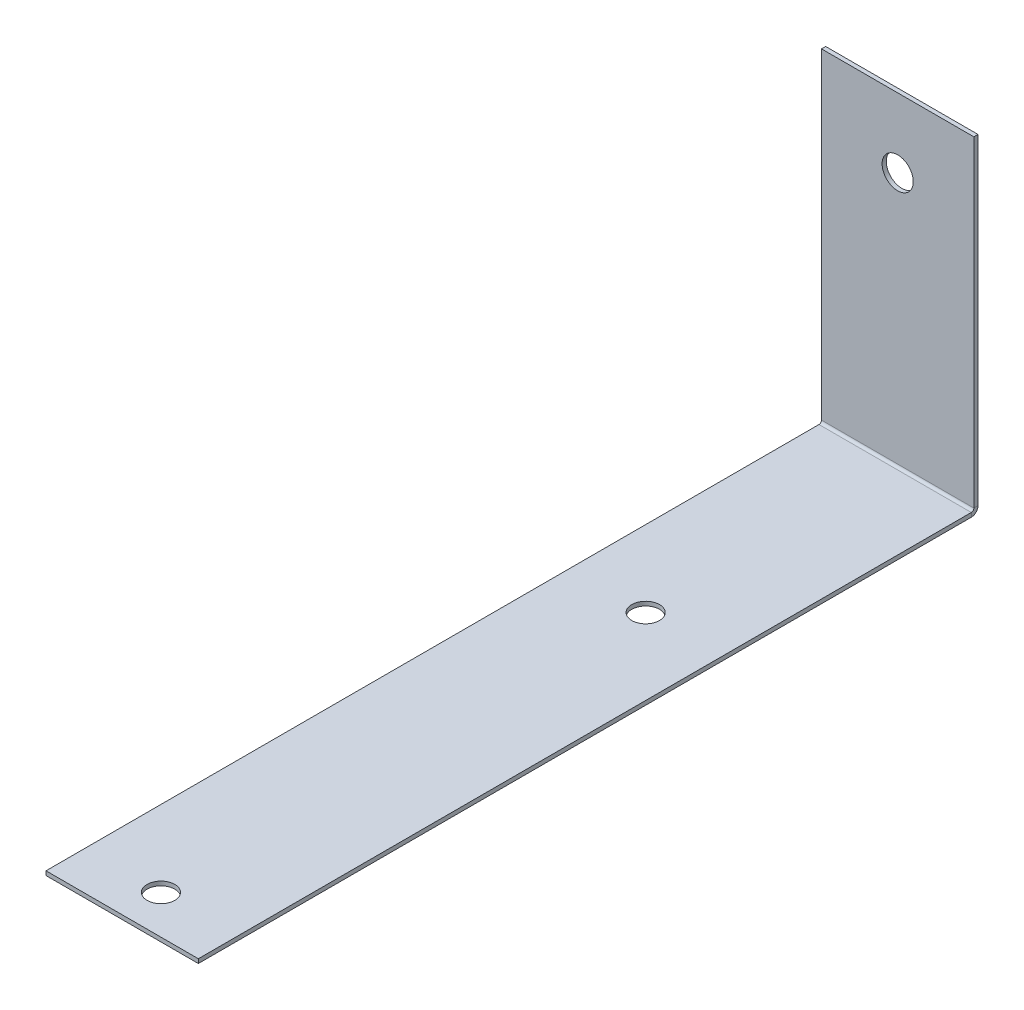
ISO-10303-21;
HEADER;
FILE_DESCRIPTION(('STEP AP214'),'2;1');
FILE_NAME('part.step','',(''),(''),'','','');
FILE_SCHEMA(('AUTOMOTIVE_DESIGN { 1 0 10303 214 1 1 1 1 }'));
ENDSEC;
DATA;
#1=APPLICATION_CONTEXT('core data for automotive mechanical design processes');
#2=APPLICATION_PROTOCOL_DEFINITION('international standard','automotive_design',2000,#1);
#3=PRODUCT_CONTEXT('',#1,'mechanical');
#4=PRODUCT('Part','Part','',(#3));
#5=PRODUCT_RELATED_PRODUCT_CATEGORY('part','',(#4));
#6=PRODUCT_DEFINITION_FORMATION('','',#4);
#7=PRODUCT_DEFINITION_CONTEXT('part definition',#1,'design');
#8=PRODUCT_DEFINITION('design','',#6,#7);
#9=PRODUCT_DEFINITION_SHAPE('','',#8);
#10=(LENGTH_UNIT() NAMED_UNIT(*) SI_UNIT(.MILLI.,.METRE.));
#11=(NAMED_UNIT(*) PLANE_ANGLE_UNIT() SI_UNIT($,.RADIAN.));
#12=(NAMED_UNIT(*) SI_UNIT($,.STERADIAN.) SOLID_ANGLE_UNIT());
#13=UNCERTAINTY_MEASURE_WITH_UNIT(LENGTH_MEASURE(1.E-05),#10,'distance_accuracy_value','');
#14=(GEOMETRIC_REPRESENTATION_CONTEXT(3) GLOBAL_UNCERTAINTY_ASSIGNED_CONTEXT((#13)) GLOBAL_UNIT_ASSIGNED_CONTEXT((#10,
#11,#12)) REPRESENTATION_CONTEXT('',''));
#15=CARTESIAN_POINT('',(0.,0.,0.));
#16=DIRECTION('',(0.,0.,1.));
#17=DIRECTION('',(1.,0.,0.));
#18=AXIS2_PLACEMENT_3D('',#15,#16,#17);
#19=CARTESIAN_POINT('',(0.,-66.4,-64.0000000000003));
#20=DIRECTION('',(0.,0.,-1.));
#21=DIRECTION('',(0.,1.,0.));
#22=AXIS2_PLACEMENT_3D('',#19,#20,#21);
#23=PLANE('',#22);
#24=CARTESIAN_POINT('',(0.,73.5999999999999,-63.9999999999998));
#25=DIRECTION('',(0.,0.,-1.));
#26=DIRECTION('',(0.,1.,0.));
#27=AXIS2_PLACEMENT_3D('',#24,#25,#26);
#28=CIRCLE('',#27,4.5);
#29=CARTESIAN_POINT('',(0.,78.0999999999999,-63.9999999999998));
#30=VERTEX_POINT('',#29);
#31=EDGE_CURVE('E210',#30,#30,#28,.T.);
#32=ORIENTED_EDGE('',*,*,#31,.T.);
#33=EDGE_LOOP('',(#32));
#34=FACE_BOUND('',#33,.T.);
#35=DIRECTION('',(0.,-1.,0.));
#36=VECTOR('',#35,1.);
#37=CARTESIAN_POINT('',(-22.,93.6,-63.9999999999997));
#38=LINE('',#37,#36);
#39=CARTESIAN_POINT('',(-22.,93.6,-63.9999999999997));
#40=VERTEX_POINT('',#39);
#41=CARTESIAN_POINT('',(-22.,0.736600000000004,-64.));
#42=VERTEX_POINT('',#41);
#43=EDGE_CURVE('E66',#40,#42,#38,.T.);
#44=ORIENTED_EDGE('',*,*,#43,.T.);
#45=DIRECTION('',(1.,0.,0.));
#46=VECTOR('',#45,1.);
#47=CARTESIAN_POINT('',(0.,0.736600000000004,-64.));
#48=LINE('',#47,#46);
#49=CARTESIAN_POINT('',(22.,0.736600000000004,-64.));
#50=VERTEX_POINT('',#49);
#51=EDGE_CURVE('E58',#42,#50,#48,.T.);
#52=ORIENTED_EDGE('',*,*,#51,.T.);
#53=DIRECTION('',(0.,1.,0.));
#54=VECTOR('',#53,1.);
#55=CARTESIAN_POINT('',(22.,93.6,-63.9999999999997));
#56=LINE('',#55,#54);
#57=CARTESIAN_POINT('',(22.,93.6,-63.9999999999997));
#58=VERTEX_POINT('',#57);
#59=EDGE_CURVE('E74',#50,#58,#56,.T.);
#60=ORIENTED_EDGE('',*,*,#59,.T.);
#61=DIRECTION('',(-1.,0.,0.));
#62=VECTOR('',#61,1.);
#63=CARTESIAN_POINT('',(22.,93.6,-63.9999999999997));
#64=LINE('',#63,#62);
#65=EDGE_CURVE('E177',#58,#40,#64,.T.);
#66=ORIENTED_EDGE('',*,*,#65,.T.);
#67=EDGE_LOOP('',(#44,#52,#60,#66));
#68=FACE_BOUND('',#67,.T.);
#69=ADVANCED_FACE('F49',(#34,#68),#23,.F.);
#70=CARTESIAN_POINT('',(-22.,93.6,-65.1999999999997));
#71=DIRECTION('',(-1.,0.,0.));
#72=DIRECTION('',(0.,-1.,0.));
#73=AXIS2_PLACEMENT_3D('',#70,#71,#72);
#74=PLANE('',#73);
#75=DIRECTION('',(0.,0.,-1.));
#76=VECTOR('',#75,1.);
#77=CARTESIAN_POINT('',(-22.,0.736600000000004,-65.2));
#78=LINE('',#77,#76);
#79=CARTESIAN_POINT('',(-22.,0.736600000000004,-65.2));
#80=VERTEX_POINT('',#79);
#81=EDGE_CURVE('E12',#42,#80,#78,.T.);
#82=ORIENTED_EDGE('',*,*,#81,.F.);
#83=ORIENTED_EDGE('',*,*,#43,.F.);
#84=DIRECTION('',(0.,0.,1.));
#85=VECTOR('',#84,1.);
#86=CARTESIAN_POINT('',(-22.,93.6,-65.1999999999997));
#87=LINE('',#86,#85);
#88=CARTESIAN_POINT('',(-22.,93.6,-65.1999999999997));
#89=VERTEX_POINT('',#88);
#90=EDGE_CURVE('E180',#89,#40,#87,.T.);
#91=ORIENTED_EDGE('',*,*,#90,.F.);
#92=DIRECTION('',(0.,-1.,0.));
#93=VECTOR('',#92,1.);
#94=CARTESIAN_POINT('',(-22.,93.6,-65.1999999999997));
#95=LINE('',#94,#93);
#96=EDGE_CURVE('E179',#89,#80,#95,.T.);
#97=ORIENTED_EDGE('',*,*,#96,.T.);
#98=EDGE_LOOP('',(#82,#83,#91,#97));
#99=FACE_BOUND('',#98,.T.);
#100=ADVANCED_FACE('F51',(#99),#74,.T.);
#101=CARTESIAN_POINT('',(22.,93.6,-65.1999999999997));
#102=DIRECTION('',(0.,1.,0.));
#103=DIRECTION('',(-1.,0.,0.));
#104=AXIS2_PLACEMENT_3D('',#101,#102,#103);
#105=PLANE('',#104);
#106=ORIENTED_EDGE('',*,*,#65,.F.);
#107=DIRECTION('',(0.,0.,1.));
#108=VECTOR('',#107,1.);
#109=CARTESIAN_POINT('',(22.,93.6,-65.1999999999997));
#110=LINE('',#109,#108);
#111=CARTESIAN_POINT('',(22.,93.6,-65.1999999999997));
#112=VERTEX_POINT('',#111);
#113=EDGE_CURVE('E175',#112,#58,#110,.T.);
#114=ORIENTED_EDGE('',*,*,#113,.F.);
#115=DIRECTION('',(-1.,0.,0.));
#116=VECTOR('',#115,1.);
#117=CARTESIAN_POINT('',(22.,93.6,-65.1999999999997));
#118=LINE('',#117,#116);
#119=EDGE_CURVE('E172',#112,#89,#118,.T.);
#120=ORIENTED_EDGE('',*,*,#119,.T.);
#121=ORIENTED_EDGE('',*,*,#90,.T.);
#122=EDGE_LOOP('',(#106,#114,#120,#121));
#123=FACE_BOUND('',#122,.T.);
#124=ADVANCED_FACE('F238',(#123),#105,.T.);
#125=CARTESIAN_POINT('',(22.,93.6,-65.1999999999997));
#126=DIRECTION('',(1.,0.,0.));
#127=DIRECTION('',(0.,1.,0.));
#128=AXIS2_PLACEMENT_3D('',#125,#126,#127);
#129=PLANE('',#128);
#130=DIRECTION('',(0.,0.,1.));
#131=VECTOR('',#130,1.);
#132=CARTESIAN_POINT('',(22.,0.736600000000004,-65.2));
#133=LINE('',#132,#131);
#134=CARTESIAN_POINT('',(22.,0.736600000000002,-65.2));
#135=VERTEX_POINT('',#134);
#136=EDGE_CURVE('E185',#135,#50,#133,.T.);
#137=ORIENTED_EDGE('',*,*,#136,.F.);
#138=DIRECTION('',(0.,1.,0.));
#139=VECTOR('',#138,1.);
#140=CARTESIAN_POINT('',(22.,93.6,-65.1999999999997));
#141=LINE('',#140,#139);
#142=EDGE_CURVE('E176',#135,#112,#141,.T.);
#143=ORIENTED_EDGE('',*,*,#142,.T.);
#144=ORIENTED_EDGE('',*,*,#113,.T.);
#145=ORIENTED_EDGE('',*,*,#59,.F.);
#146=EDGE_LOOP('',(#137,#143,#144,#145));
#147=FACE_BOUND('',#146,.T.);
#148=ADVANCED_FACE('F230',(#147),#129,.T.);
#149=CARTESIAN_POINT('',(0.,-66.4,-65.2000000000003));
#150=DIRECTION('',(0.,0.,-1.));
#151=DIRECTION('',(0.,1.,0.));
#152=AXIS2_PLACEMENT_3D('',#149,#150,#151);
#153=PLANE('',#152);
#154=CARTESIAN_POINT('',(0.,73.5999999999999,-65.1999999999998));
#155=DIRECTION('',(0.,0.,-1.));
#156=DIRECTION('',(0.,1.,0.));
#157=AXIS2_PLACEMENT_3D('',#154,#155,#156);
#158=CIRCLE('',#157,4.5);
#159=CARTESIAN_POINT('',(0.,78.0999999999999,-65.1999999999997));
#160=VERTEX_POINT('',#159);
#161=EDGE_CURVE('E199',#160,#160,#158,.T.);
#162=ORIENTED_EDGE('',*,*,#161,.F.);
#163=EDGE_LOOP('',(#162));
#164=FACE_BOUND('',#163,.T.);
#165=DIRECTION('',(1.,0.,0.));
#166=VECTOR('',#165,1.);
#167=CARTESIAN_POINT('',(0.,0.736600000000004,-65.2));
#168=LINE('',#167,#166);
#169=EDGE_CURVE('E182',#80,#135,#168,.T.);
#170=ORIENTED_EDGE('',*,*,#169,.F.);
#171=ORIENTED_EDGE('',*,*,#96,.F.);
#172=ORIENTED_EDGE('',*,*,#119,.F.);
#173=ORIENTED_EDGE('',*,*,#142,.F.);
#174=EDGE_LOOP('',(#170,#171,#172,#173));
#175=FACE_BOUND('',#174,.T.);
#176=ADVANCED_FACE('F234',(#164,#175),#153,.T.);
#177=CARTESIAN_POINT('',(22.,-1.2,160.));
#178=DIRECTION('',(0.,0.,1.));
#179=DIRECTION('',(1.,0.,0.));
#180=AXIS2_PLACEMENT_3D('',#177,#178,#179);
#181=PLANE('',#180);
#182=DIRECTION('',(1.,0.,0.));
#183=VECTOR('',#182,1.);
#184=CARTESIAN_POINT('',(22.,0.,160.));
#185=LINE('',#184,#183);
#186=CARTESIAN_POINT('',(-22.,0.,160.));
#187=VERTEX_POINT('',#186);
#188=CARTESIAN_POINT('',(22.,0.,160.));
#189=VERTEX_POINT('',#188);
#190=EDGE_CURVE('E157',#187,#189,#185,.T.);
#191=ORIENTED_EDGE('',*,*,#190,.F.);
#192=DIRECTION('',(0.,1.,0.));
#193=VECTOR('',#192,1.);
#194=CARTESIAN_POINT('',(-22.,-1.2,160.));
#195=LINE('',#194,#193);
#196=CARTESIAN_POINT('',(-22.,-1.2,160.));
#197=VERTEX_POINT('',#196);
#198=EDGE_CURVE('E148',#197,#187,#195,.T.);
#199=ORIENTED_EDGE('',*,*,#198,.F.);
#200=DIRECTION('',(1.,0.,0.));
#201=VECTOR('',#200,1.);
#202=CARTESIAN_POINT('',(22.,-1.2,160.));
#203=LINE('',#202,#201);
#204=CARTESIAN_POINT('',(22.,-1.2,160.));
#205=VERTEX_POINT('',#204);
#206=EDGE_CURVE('E144',#197,#205,#203,.T.);
#207=ORIENTED_EDGE('',*,*,#206,.T.);
#208=DIRECTION('',(0.,1.,0.));
#209=VECTOR('',#208,1.);
#210=CARTESIAN_POINT('',(22.,-1.2,160.));
#211=LINE('',#210,#209);
#212=EDGE_CURVE('E138',#205,#189,#211,.T.);
#213=ORIENTED_EDGE('',*,*,#212,.T.);
#214=EDGE_LOOP('',(#191,#199,#207,#213));
#215=FACE_BOUND('',#214,.T.);
#216=ADVANCED_FACE('F219',(#215),#181,.T.);
#217=CARTESIAN_POINT('',(0.,-1.2,0.));
#218=DIRECTION('',(0.,-1.,0.));
#219=DIRECTION('',(0.,0.,-1.));
#220=AXIS2_PLACEMENT_3D('',#217,#218,#219);
#221=PLANE('',#220);
#222=CARTESIAN_POINT('',(0.,-1.2,8.79999999999997));
#223=DIRECTION('',(0.,-1.,0.));
#224=DIRECTION('',(0.,0.,-1.));
#225=AXIS2_PLACEMENT_3D('',#222,#223,#224);
#226=CIRCLE('',#225,4.);
#227=CARTESIAN_POINT('',(0.,-1.2,4.79999999999997));
#228=VERTEX_POINT('',#227);
#229=EDGE_CURVE('E195',#228,#228,#226,.T.);
#230=ORIENTED_EDGE('',*,*,#229,.F.);
#231=EDGE_LOOP('',(#230));
#232=FACE_BOUND('',#231,.T.);
#233=CARTESIAN_POINT('',(0.,-1.2,148.8));
#234=DIRECTION('',(0.,-1.,0.));
#235=DIRECTION('',(0.,0.,-1.));
#236=AXIS2_PLACEMENT_3D('',#233,#234,#235);
#237=CIRCLE('',#236,4.);
#238=CARTESIAN_POINT('',(0.,-1.2,144.8));
#239=VERTEX_POINT('',#238);
#240=EDGE_CURVE('E201',#239,#239,#237,.T.);
#241=ORIENTED_EDGE('',*,*,#240,.F.);
#242=EDGE_LOOP('',(#241));
#243=FACE_BOUND('',#242,.T.);
#244=DIRECTION('',(0.,0.,1.));
#245=VECTOR('',#244,1.);
#246=CARTESIAN_POINT('',(-22.,-1.2,-160.));
#247=LINE('',#246,#245);
#248=CARTESIAN_POINT('',(-22.,-1.2,-63.2634));
#249=VERTEX_POINT('',#248);
#250=EDGE_CURVE('E141',#249,#197,#247,.T.);
#251=ORIENTED_EDGE('',*,*,#250,.F.);
#252=DIRECTION('',(1.,0.,0.));
#253=VECTOR('',#252,1.);
#254=CARTESIAN_POINT('',(0.,-1.2,-63.2634));
#255=LINE('',#254,#253);
#256=CARTESIAN_POINT('',(22.,-1.2,-63.2634));
#257=VERTEX_POINT('',#256);
#258=EDGE_CURVE('E130',#249,#257,#255,.T.);
#259=ORIENTED_EDGE('',*,*,#258,.T.);
#260=DIRECTION('',(0.,0.,-1.));
#261=VECTOR('',#260,1.);
#262=CARTESIAN_POINT('',(22.,-1.2,-160.));
#263=LINE('',#262,#261);
#264=EDGE_CURVE('E137',#205,#257,#263,.T.);
#265=ORIENTED_EDGE('',*,*,#264,.F.);
#266=ORIENTED_EDGE('',*,*,#206,.F.);
#267=EDGE_LOOP('',(#251,#259,#265,#266));
#268=FACE_BOUND('',#267,.T.);
#269=ADVANCED_FACE('F142',(#232,#243,#268),#221,.T.);
#270=CARTESIAN_POINT('',(22.,-1.2,-160.));
#271=DIRECTION('',(1.,0.,0.));
#272=DIRECTION('',(0.,0.,-1.));
#273=AXIS2_PLACEMENT_3D('',#270,#271,#272);
#274=PLANE('',#273);
#275=ORIENTED_EDGE('',*,*,#264,.T.);
#276=DIRECTION('',(0.,1.,0.));
#277=VECTOR('',#276,1.);
#278=CARTESIAN_POINT('',(22.,-1.19999999999999,-63.2634));
#279=LINE('',#278,#277);
#280=CARTESIAN_POINT('',(22.,0.,-63.2634));
#281=VERTEX_POINT('',#280);
#282=EDGE_CURVE('E164',#257,#281,#279,.T.);
#283=ORIENTED_EDGE('',*,*,#282,.T.);
#284=DIRECTION('',(0.,0.,-1.));
#285=VECTOR('',#284,1.);
#286=CARTESIAN_POINT('',(22.,0.,-160.));
#287=LINE('',#286,#285);
#288=EDGE_CURVE('E154',#189,#281,#287,.T.);
#289=ORIENTED_EDGE('',*,*,#288,.F.);
#290=ORIENTED_EDGE('',*,*,#212,.F.);
#291=EDGE_LOOP('',(#275,#283,#289,#290));
#292=FACE_BOUND('',#291,.T.);
#293=ADVANCED_FACE('F258',(#292),#274,.T.);
#294=CARTESIAN_POINT('',(0.,0.,0.));
#295=DIRECTION('',(0.,-1.,0.));
#296=DIRECTION('',(0.,0.,-1.));
#297=AXIS2_PLACEMENT_3D('',#294,#295,#296);
#298=PLANE('',#297);
#299=CARTESIAN_POINT('',(0.,0.,8.79999999999997));
#300=DIRECTION('',(0.,-1.,0.));
#301=DIRECTION('',(0.,0.,-1.));
#302=AXIS2_PLACEMENT_3D('',#299,#300,#301);
#303=CIRCLE('',#302,4.);
#304=CARTESIAN_POINT('',(0.,0.,4.79999999999997));
#305=VERTEX_POINT('',#304);
#306=EDGE_CURVE('E53',#305,#305,#303,.T.);
#307=ORIENTED_EDGE('',*,*,#306,.T.);
#308=EDGE_LOOP('',(#307));
#309=FACE_BOUND('',#308,.T.);
#310=CARTESIAN_POINT('',(0.,0.,148.8));
#311=DIRECTION('',(0.,-1.,0.));
#312=DIRECTION('',(0.,0.,-1.));
#313=AXIS2_PLACEMENT_3D('',#310,#311,#312);
#314=CIRCLE('',#313,4.);
#315=CARTESIAN_POINT('',(0.,0.,144.8));
#316=VERTEX_POINT('',#315);
#317=EDGE_CURVE('E193',#316,#316,#314,.T.);
#318=ORIENTED_EDGE('',*,*,#317,.T.);
#319=EDGE_LOOP('',(#318));
#320=FACE_BOUND('',#319,.T.);
#321=DIRECTION('',(1.,0.,0.));
#322=VECTOR('',#321,1.);
#323=CARTESIAN_POINT('',(0.,0.,-63.2634));
#324=LINE('',#323,#322);
#325=CARTESIAN_POINT('',(-22.,0.,-63.2634));
#326=VERTEX_POINT('',#325);
#327=EDGE_CURVE('E170',#326,#281,#324,.T.);
#328=ORIENTED_EDGE('',*,*,#327,.F.);
#329=DIRECTION('',(0.,0.,1.));
#330=VECTOR('',#329,1.);
#331=CARTESIAN_POINT('',(-22.,0.,-160.));
#332=LINE('',#331,#330);
#333=EDGE_CURVE('E152',#326,#187,#332,.T.);
#334=ORIENTED_EDGE('',*,*,#333,.T.);
#335=ORIENTED_EDGE('',*,*,#190,.T.);
#336=ORIENTED_EDGE('',*,*,#288,.T.);
#337=EDGE_LOOP('',(#328,#334,#335,#336));
#338=FACE_BOUND('',#337,.T.);
#339=ADVANCED_FACE('F222',(#309,#320,#338),#298,.F.);
#340=CARTESIAN_POINT('',(-22.,-1.2,-160.));
#341=DIRECTION('',(-1.,0.,0.));
#342=DIRECTION('',(0.,0.,1.));
#343=AXIS2_PLACEMENT_3D('',#340,#341,#342);
#344=PLANE('',#343);
#345=ORIENTED_EDGE('',*,*,#333,.F.);
#346=DIRECTION('',(0.,-1.,0.));
#347=VECTOR('',#346,1.);
#348=CARTESIAN_POINT('',(-22.,-1.19999999999999,-63.2634));
#349=LINE('',#348,#347);
#350=EDGE_CURVE('E121',#326,#249,#349,.T.);
#351=ORIENTED_EDGE('',*,*,#350,.T.);
#352=ORIENTED_EDGE('',*,*,#250,.T.);
#353=ORIENTED_EDGE('',*,*,#198,.T.);
#354=EDGE_LOOP('',(#345,#351,#352,#353));
#355=FACE_BOUND('',#354,.T.);
#356=ADVANCED_FACE('F151',(#355),#344,.T.);
#357=CARTESIAN_POINT('',(-22.,0.7366,-63.2634));
#358=DIRECTION('',(-1.,0.,0.));
#359=DIRECTION('',(0.,0.,1.));
#360=AXIS2_PLACEMENT_3D('',#357,#358,#359);
#361=PLANE('',#360);
#362=ORIENTED_EDGE('',*,*,#350,.F.);
#363=CARTESIAN_POINT('',(-22.,0.7366,-63.2634));
#364=DIRECTION('',(1.,0.,0.));
#365=DIRECTION('',(0.,0.,-1.));
#366=AXIS2_PLACEMENT_3D('',#363,#364,#365);
#367=CIRCLE('',#366,0.7366);
#368=EDGE_CURVE('E212',#326,#42,#367,.T.);
#369=ORIENTED_EDGE('',*,*,#368,.T.);
#370=ORIENTED_EDGE('',*,*,#81,.T.);
#371=CARTESIAN_POINT('',(-22.,0.7366,-63.2634));
#372=DIRECTION('',(1.,0.,0.));
#373=DIRECTION('',(0.,0.,1.));
#374=AXIS2_PLACEMENT_3D('',#371,#372,#373);
#375=CIRCLE('',#374,1.9366);
#376=EDGE_CURVE('E116',#249,#80,#375,.T.);
#377=ORIENTED_EDGE('',*,*,#376,.F.);
#378=EDGE_LOOP('',(#362,#369,#370,#377));
#379=FACE_BOUND('',#378,.T.);
#380=ADVANCED_FACE('F118',(#379),#361,.T.);
#381=CARTESIAN_POINT('',(22.,0.7366,-63.2634));
#382=DIRECTION('',(1.,0.,0.));
#383=DIRECTION('',(0.,0.,-1.));
#384=AXIS2_PLACEMENT_3D('',#381,#382,#383);
#385=PLANE('',#384);
#386=ORIENTED_EDGE('',*,*,#136,.T.);
#387=CARTESIAN_POINT('',(22.,0.7366,-63.2634));
#388=DIRECTION('',(1.,0.,0.));
#389=DIRECTION('',(0.,0.,-1.));
#390=AXIS2_PLACEMENT_3D('',#387,#388,#389);
#391=CIRCLE('',#390,0.7366);
#392=EDGE_CURVE('E126',#50,#281,#391,.F.);
#393=ORIENTED_EDGE('',*,*,#392,.T.);
#394=ORIENTED_EDGE('',*,*,#282,.F.);
#395=CARTESIAN_POINT('',(22.,0.7366,-63.2634));
#396=DIRECTION('',(-1.,0.,0.));
#397=DIRECTION('',(0.,0.,-1.));
#398=AXIS2_PLACEMENT_3D('',#395,#396,#397);
#399=CIRCLE('',#398,1.9366);
#400=EDGE_CURVE('E125',#135,#257,#399,.T.);
#401=ORIENTED_EDGE('',*,*,#400,.F.);
#402=EDGE_LOOP('',(#386,#393,#394,#401));
#403=FACE_BOUND('',#402,.T.);
#404=ADVANCED_FACE('F228',(#403),#385,.T.);
#405=CARTESIAN_POINT('',(-44.1864422446524,0.7366,-63.2634));
#406=DIRECTION('',(1.,0.,0.));
#407=DIRECTION('',(0.,0.,-1.));
#408=AXIS2_PLACEMENT_3D('',#405,#406,#407);
#409=CYLINDRICAL_SURFACE('',#408,1.9366);
#410=ORIENTED_EDGE('',*,*,#400,.T.);
#411=ORIENTED_EDGE('',*,*,#258,.F.);
#412=ORIENTED_EDGE('',*,*,#376,.T.);
#413=ORIENTED_EDGE('',*,*,#169,.T.);
#414=EDGE_LOOP('',(#410,#411,#412,#413));
#415=FACE_BOUND('',#414,.T.);
#416=ADVANCED_FACE('F132',(#415),#409,.T.);
#417=CARTESIAN_POINT('',(-44.1864422446524,0.7366,-63.2634));
#418=DIRECTION('',(1.,0.,0.));
#419=DIRECTION('',(0.,0.,-1.));
#420=AXIS2_PLACEMENT_3D('',#417,#418,#419);
#421=CYLINDRICAL_SURFACE('',#420,0.7366);
#422=ORIENTED_EDGE('',*,*,#392,.F.);
#423=ORIENTED_EDGE('',*,*,#51,.F.);
#424=ORIENTED_EDGE('',*,*,#368,.F.);
#425=ORIENTED_EDGE('',*,*,#327,.T.);
#426=EDGE_LOOP('',(#422,#423,#424,#425));
#427=FACE_BOUND('',#426,.T.);
#428=ADVANCED_FACE('F225',(#427),#421,.F.);
#429=CARTESIAN_POINT('',(0.,73.5999999999999,-55.1999999999998));
#430=DIRECTION('',(0.,0.,-1.));
#431=DIRECTION('',(0.,1.,0.));
#432=AXIS2_PLACEMENT_3D('',#429,#430,#431);
#433=CYLINDRICAL_SURFACE('',#432,4.5);
#434=ORIENTED_EDGE('',*,*,#161,.T.);
#435=EDGE_LOOP('',(#434));
#436=FACE_BOUND('',#435,.T.);
#437=ORIENTED_EDGE('',*,*,#31,.F.);
#438=EDGE_LOOP('',(#437));
#439=FACE_BOUND('',#438,.T.);
#440=ADVANCED_FACE('F273',(#436,#439),#433,.F.);
#441=CARTESIAN_POINT('',(0.,8.8,148.8));
#442=DIRECTION('',(0.,-1.,0.));
#443=DIRECTION('',(0.,0.,-1.));
#444=AXIS2_PLACEMENT_3D('',#441,#442,#443);
#445=CYLINDRICAL_SURFACE('',#444,4.);
#446=ORIENTED_EDGE('',*,*,#240,.T.);
#447=EDGE_LOOP('',(#446));
#448=FACE_BOUND('',#447,.T.);
#449=ORIENTED_EDGE('',*,*,#317,.F.);
#450=EDGE_LOOP('',(#449));
#451=FACE_BOUND('',#450,.T.);
#452=ADVANCED_FACE('F278',(#448,#451),#445,.F.);
#453=CARTESIAN_POINT('',(0.,8.8,8.79999999999997));
#454=DIRECTION('',(0.,-1.,0.));
#455=DIRECTION('',(0.,0.,-1.));
#456=AXIS2_PLACEMENT_3D('',#453,#454,#455);
#457=CYLINDRICAL_SURFACE('',#456,4.);
#458=ORIENTED_EDGE('',*,*,#229,.T.);
#459=EDGE_LOOP('',(#458));
#460=FACE_BOUND('',#459,.T.);
#461=ORIENTED_EDGE('',*,*,#306,.F.);
#462=EDGE_LOOP('',(#461));
#463=FACE_BOUND('',#462,.T.);
#464=ADVANCED_FACE('F282',(#460,#463),#457,.F.);
#465=CLOSED_SHELL('',(#69,#100,#124,#148,#176,#216,#269,#293,#339,#356,#380,#404,#416,#428,#440,
#452,#464));
#466=MANIFOLD_SOLID_BREP('B2',#465);
#467=ADVANCED_BREP_SHAPE_REPRESENTATION('',(#18,#466),#14);
#468=SHAPE_DEFINITION_REPRESENTATION(#9,#467);
ENDSEC;
END-ISO-10303-21;
